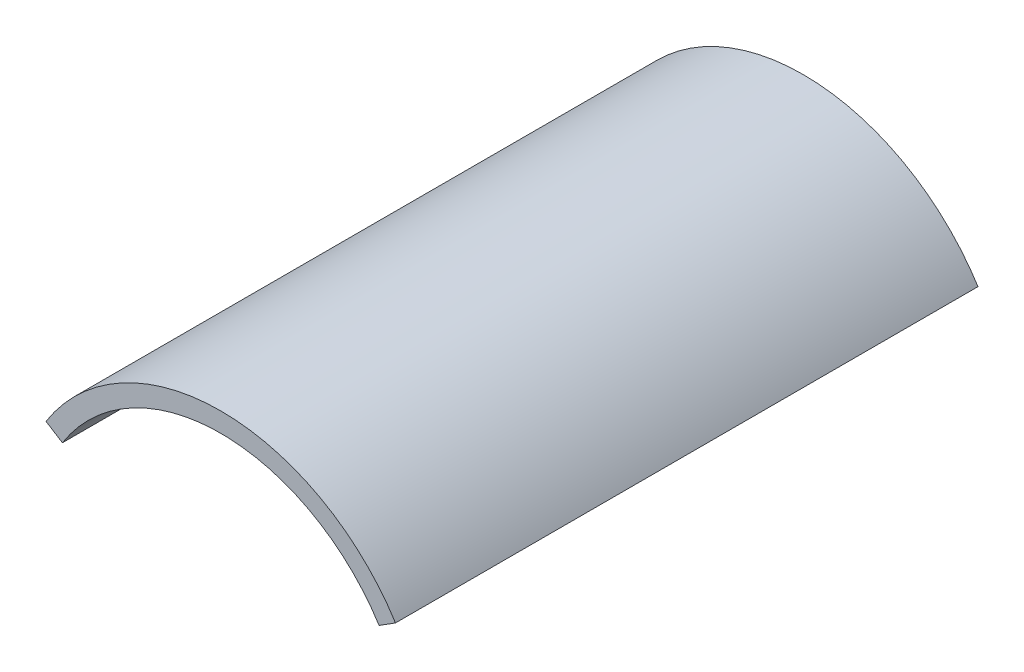
ISO-10303-21;
HEADER;
FILE_DESCRIPTION(('STEP AP214'),'2;1');
FILE_NAME('part.step','',(''),(''),'','','');
FILE_SCHEMA(('AUTOMOTIVE_DESIGN { 1 0 10303 214 1 1 1 1 }'));
ENDSEC;
DATA;
#1=APPLICATION_CONTEXT('core data for automotive mechanical design processes');
#2=APPLICATION_PROTOCOL_DEFINITION('international standard','automotive_design',2000,#1);
#3=PRODUCT_CONTEXT('',#1,'mechanical');
#4=PRODUCT('Part','Part','',(#3));
#5=PRODUCT_RELATED_PRODUCT_CATEGORY('part','',(#4));
#6=PRODUCT_DEFINITION_FORMATION('','',#4);
#7=PRODUCT_DEFINITION_CONTEXT('part definition',#1,'design');
#8=PRODUCT_DEFINITION('design','',#6,#7);
#9=PRODUCT_DEFINITION_SHAPE('','',#8);
#10=(LENGTH_UNIT() NAMED_UNIT(*) SI_UNIT(.MILLI.,.METRE.));
#11=(NAMED_UNIT(*) PLANE_ANGLE_UNIT() SI_UNIT($,.RADIAN.));
#12=(NAMED_UNIT(*) SI_UNIT($,.STERADIAN.) SOLID_ANGLE_UNIT());
#13=UNCERTAINTY_MEASURE_WITH_UNIT(LENGTH_MEASURE(1.E-05),#10,'distance_accuracy_value','');
#14=(GEOMETRIC_REPRESENTATION_CONTEXT(3) GLOBAL_UNCERTAINTY_ASSIGNED_CONTEXT((#13)) GLOBAL_UNIT_ASSIGNED_CONTEXT((#10,
#11,#12)) REPRESENTATION_CONTEXT('',''));
#15=CARTESIAN_POINT('',(0.,0.,0.));
#16=DIRECTION('',(0.,0.,1.));
#17=DIRECTION('',(1.,0.,0.));
#18=AXIS2_PLACEMENT_3D('',#15,#16,#17);
#19=CARTESIAN_POINT('',(1.60618223380865,-28.7994168247171,150.));
#20=DIRECTION('',(0.,0.,-1.));
#21=DIRECTION('',(-1.,0.,0.));
#22=AXIS2_PLACEMENT_3D('',#19,#20,#21);
#23=CYLINDRICAL_SURFACE('',#22,48.2050521033694);
#24=CARTESIAN_POINT('',(1.60618223380865,-28.7994168247171,0.));
#25=DIRECTION('',(0.,0.,1.));
#26=DIRECTION('',(1.,0.,0.));
#27=AXIS2_PLACEMENT_3D('',#24,#25,#26);
#28=CIRCLE('',#27,48.2050521033694);
#29=CARTESIAN_POINT('',(-39.1761416064263,-3.09865593172482,0.));
#30=VERTEX_POINT('',#29);
#31=CARTESIAN_POINT('',(42.3660149706274,-3.06300130982622,0.));
#32=VERTEX_POINT('',#31);
#33=EDGE_CURVE('E111',#30,#32,#28,.F.);
#34=ORIENTED_EDGE('',*,*,#33,.T.);
#35=DIRECTION('',(0.,0.,-1.));
#36=VECTOR('',#35,1.);
#37=CARTESIAN_POINT('',(42.3660149706274,-3.06300130982622,150.));
#38=LINE('',#37,#36);
#39=CARTESIAN_POINT('',(42.3660149706274,-3.06300130982622,150.));
#40=VERTEX_POINT('',#39);
#41=EDGE_CURVE('E11',#40,#32,#38,.T.);
#42=ORIENTED_EDGE('',*,*,#41,.F.);
#43=CARTESIAN_POINT('',(1.60618223380865,-28.7994168247171,150.));
#44=DIRECTION('',(0.,0.,1.));
#45=DIRECTION('',(1.,0.,0.));
#46=AXIS2_PLACEMENT_3D('',#43,#44,#45);
#47=CIRCLE('',#46,48.2050521033694);
#48=CARTESIAN_POINT('',(-39.1761416064263,-3.09865593172482,150.));
#49=VERTEX_POINT('',#48);
#50=EDGE_CURVE('E84',#49,#40,#47,.F.);
#51=ORIENTED_EDGE('',*,*,#50,.F.);
#52=DIRECTION('',(0.,0.,-1.));
#53=VECTOR('',#52,1.);
#54=CARTESIAN_POINT('',(-39.1761416064263,-3.09865593172482,150.));
#55=LINE('',#54,#53);
#56=EDGE_CURVE('E60',#49,#30,#55,.T.);
#57=ORIENTED_EDGE('',*,*,#56,.T.);
#58=EDGE_LOOP('',(#34,#42,#51,#57));
#59=FACE_BOUND('',#58,.T.);
#60=ADVANCED_FACE('F43',(#59),#23,.F.);
#61=CARTESIAN_POINT('',(46.5937702533532,-0.393528464977661,150.));
#62=DIRECTION('',(0.533894568969713,-0.845551056545165,0.));
#63=DIRECTION('',(0.845551056545165,0.533894568969713,0.));
#64=AXIS2_PLACEMENT_3D('',#61,#62,#63);
#65=PLANE('',#64);
#66=DIRECTION('',(-0.845551056545165,-0.533894568969713,0.));
#67=VECTOR('',#66,1.);
#68=CARTESIAN_POINT('',(46.5937702533532,-0.393528464977661,0.));
#69=LINE('',#68,#67);
#70=CARTESIAN_POINT('',(46.5937702533532,-0.393528464977661,0.));
#71=VERTEX_POINT('',#70);
#72=EDGE_CURVE('E93',#71,#32,#69,.T.);
#73=ORIENTED_EDGE('',*,*,#72,.F.);
#74=DIRECTION('',(0.,0.,-1.));
#75=VECTOR('',#74,1.);
#76=CARTESIAN_POINT('',(46.5937702533532,-0.393528464977661,150.));
#77=LINE('',#76,#75);
#78=CARTESIAN_POINT('',(46.5937702533532,-0.393528464977661,150.));
#79=VERTEX_POINT('',#78);
#80=EDGE_CURVE('E52',#79,#71,#77,.T.);
#81=ORIENTED_EDGE('',*,*,#80,.F.);
#82=DIRECTION('',(-0.845551056545165,-0.533894568969713,0.));
#83=VECTOR('',#82,1.);
#84=CARTESIAN_POINT('',(46.5937702533532,-0.393528464977661,150.));
#85=LINE('',#84,#83);
#86=EDGE_CURVE('E91',#79,#40,#85,.T.);
#87=ORIENTED_EDGE('',*,*,#86,.T.);
#88=ORIENTED_EDGE('',*,*,#41,.T.);
#89=EDGE_LOOP('',(#73,#81,#87,#88));
#90=FACE_BOUND('',#89,.T.);
#91=ADVANCED_FACE('F90',(#90),#65,.T.);
#92=CARTESIAN_POINT('',(1.60618223380865,-28.7994168247171,150.));
#93=DIRECTION('',(0.,0.,-1.));
#94=DIRECTION('',(-1.,0.,0.));
#95=AXIS2_PLACEMENT_3D('',#92,#93,#94);
#96=CYLINDRICAL_SURFACE('',#95,53.2050521033694);
#97=CARTESIAN_POINT('',(1.60618223380865,-28.7994168247171,0.));
#98=DIRECTION('',(0.,0.,-1.));
#99=DIRECTION('',(-1.,0.,0.));
#100=AXIS2_PLACEMENT_3D('',#97,#98,#99);
#101=CIRCLE('',#100,53.2050521033694);
#102=CARTESIAN_POINT('',(-43.4062297466468,-0.432881311475421,0.));
#103=VERTEX_POINT('',#102);
#104=EDGE_CURVE('E116',#103,#71,#101,.T.);
#105=ORIENTED_EDGE('',*,*,#104,.F.);
#106=DIRECTION('',(0.,0.,-1.));
#107=VECTOR('',#106,1.);
#108=CARTESIAN_POINT('',(-43.4062297466468,-0.432881311475421,150.));
#109=LINE('',#108,#107);
#110=CARTESIAN_POINT('',(-43.4062297466468,-0.432881311475421,150.));
#111=VERTEX_POINT('',#110);
#112=EDGE_CURVE('E73',#111,#103,#109,.T.);
#113=ORIENTED_EDGE('',*,*,#112,.F.);
#114=CARTESIAN_POINT('',(1.60618223380865,-28.7994168247171,150.));
#115=DIRECTION('',(0.,0.,-1.));
#116=DIRECTION('',(-1.,0.,0.));
#117=AXIS2_PLACEMENT_3D('',#114,#115,#116);
#118=CIRCLE('',#117,53.2050521033694);
#119=EDGE_CURVE('E100',#111,#79,#118,.T.);
#120=ORIENTED_EDGE('',*,*,#119,.T.);
#121=ORIENTED_EDGE('',*,*,#80,.T.);
#122=EDGE_LOOP('',(#105,#113,#120,#121));
#123=FACE_BOUND('',#122,.T.);
#124=ADVANCED_FACE('F103',(#123),#96,.T.);
#125=CARTESIAN_POINT('',(-39.1761416064263,-3.09865593172482,150.));
#126=DIRECTION('',(-0.53315492404988,-0.846017628044101,0.));
#127=DIRECTION('',(0.846017628044101,-0.53315492404988,0.));
#128=AXIS2_PLACEMENT_3D('',#125,#126,#127);
#129=PLANE('',#128);
#130=DIRECTION('',(-0.846017628044101,0.53315492404988,0.));
#131=VECTOR('',#130,1.);
#132=CARTESIAN_POINT('',(-39.1761416064263,-3.09865593172482,0.));
#133=LINE('',#132,#131);
#134=EDGE_CURVE('E119',#30,#103,#133,.T.);
#135=ORIENTED_EDGE('',*,*,#134,.F.);
#136=ORIENTED_EDGE('',*,*,#56,.F.);
#137=DIRECTION('',(-0.846017628044101,0.53315492404988,0.));
#138=VECTOR('',#137,1.);
#139=CARTESIAN_POINT('',(-39.1761416064263,-3.09865593172482,150.));
#140=LINE('',#139,#138);
#141=EDGE_CURVE('E105',#49,#111,#140,.T.);
#142=ORIENTED_EDGE('',*,*,#141,.T.);
#143=ORIENTED_EDGE('',*,*,#112,.T.);
#144=EDGE_LOOP('',(#135,#136,#142,#143));
#145=FACE_BOUND('',#144,.T.);
#146=ADVANCED_FACE('F129',(#145),#129,.T.);
#147=CARTESIAN_POINT('',(1.60618223380865,-28.7994168247171,150.));
#148=DIRECTION('',(0.,0.,1.));
#149=DIRECTION('',(1.,0.,0.));
#150=AXIS2_PLACEMENT_3D('',#147,#148,#149);
#151=PLANE('',#150);
#152=ORIENTED_EDGE('',*,*,#50,.T.);
#153=ORIENTED_EDGE('',*,*,#86,.F.);
#154=ORIENTED_EDGE('',*,*,#119,.F.);
#155=ORIENTED_EDGE('',*,*,#141,.F.);
#156=EDGE_LOOP('',(#152,#153,#154,#155));
#157=FACE_BOUND('',#156,.T.);
#158=ADVANCED_FACE('F99',(#157),#151,.T.);
#159=CARTESIAN_POINT('',(1.60618223380865,-28.7994168247171,0.));
#160=DIRECTION('',(0.,0.,1.));
#161=DIRECTION('',(1.,0.,0.));
#162=AXIS2_PLACEMENT_3D('',#159,#160,#161);
#163=PLANE('',#162);
#164=ORIENTED_EDGE('',*,*,#33,.F.);
#165=ORIENTED_EDGE('',*,*,#134,.T.);
#166=ORIENTED_EDGE('',*,*,#104,.T.);
#167=ORIENTED_EDGE('',*,*,#72,.T.);
#168=EDGE_LOOP('',(#164,#165,#166,#167));
#169=FACE_BOUND('',#168,.T.);
#170=ADVANCED_FACE('F128',(#169),#163,.F.);
#171=CLOSED_SHELL('',(#60,#91,#124,#146,#158,#170));
#172=MANIFOLD_SOLID_BREP('B2',#171);
#173=ADVANCED_BREP_SHAPE_REPRESENTATION('',(#18,#172),#14);
#174=SHAPE_DEFINITION_REPRESENTATION(#9,#173);
ENDSEC;
END-ISO-10303-21;
